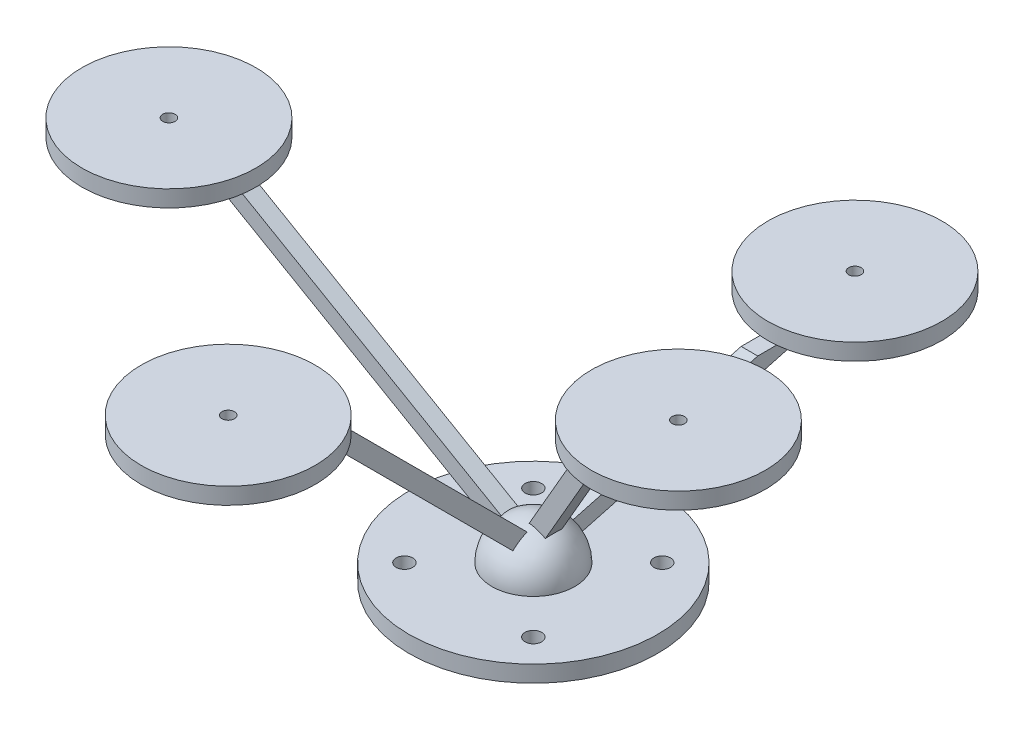
ISO-10303-21;
HEADER;
FILE_DESCRIPTION(('STEP AP214'),'2;1');
FILE_NAME('part.step','',(''),(''),'','','');
FILE_SCHEMA(('AUTOMOTIVE_DESIGN { 1 0 10303 214 1 1 1 1 }'));
ENDSEC;
DATA;
#1=APPLICATION_CONTEXT('core data for automotive mechanical design processes');
#2=APPLICATION_PROTOCOL_DEFINITION('international standard','automotive_design',2000,#1);
#3=PRODUCT_CONTEXT('',#1,'mechanical');
#4=PRODUCT('Part','Part','',(#3));
#5=PRODUCT_RELATED_PRODUCT_CATEGORY('part','',(#4));
#6=PRODUCT_DEFINITION_FORMATION('','',#4);
#7=PRODUCT_DEFINITION_CONTEXT('part definition',#1,'design');
#8=PRODUCT_DEFINITION('design','',#6,#7);
#9=PRODUCT_DEFINITION_SHAPE('','',#8);
#10=(LENGTH_UNIT() NAMED_UNIT(*) SI_UNIT(.MILLI.,.METRE.));
#11=(NAMED_UNIT(*) PLANE_ANGLE_UNIT() SI_UNIT($,.RADIAN.));
#12=(NAMED_UNIT(*) SI_UNIT($,.STERADIAN.) SOLID_ANGLE_UNIT());
#13=UNCERTAINTY_MEASURE_WITH_UNIT(LENGTH_MEASURE(1.E-05),#10,'distance_accuracy_value','');
#14=(GEOMETRIC_REPRESENTATION_CONTEXT(3) GLOBAL_UNCERTAINTY_ASSIGNED_CONTEXT((#13)) GLOBAL_UNIT_ASSIGNED_CONTEXT((#10,
#11,#12)) REPRESENTATION_CONTEXT('',''));
#15=CARTESIAN_POINT('',(0.,0.,0.));
#16=DIRECTION('',(0.,0.,1.));
#17=DIRECTION('',(1.,0.,0.));
#18=AXIS2_PLACEMENT_3D('',#15,#16,#17);
#19=CARTESIAN_POINT('',(0.,2.,0.));
#20=DIRECTION('',(0.,-1.,0.));
#21=DIRECTION('',(0.,0.,-1.));
#22=AXIS2_PLACEMENT_3D('',#19,#20,#21);
#23=SPHERICAL_SURFACE('',#22,5.);
#24=CARTESIAN_POINT('',(0.,2.,0.));
#25=DIRECTION('',(0.,1.,0.));
#26=DIRECTION('',(0.,0.,1.));
#27=AXIS2_PLACEMENT_3D('',#24,#25,#26);
#28=CIRCLE('',#27,5.);
#29=CARTESIAN_POINT('',(0.,2.,5.));
#30=VERTEX_POINT('',#29);
#31=EDGE_CURVE('E330',#30,#30,#28,.T.);
#32=ORIENTED_EDGE('',*,*,#31,.T.);
#33=EDGE_LOOP('',(#32));
#34=FACE_BOUND('',#33,.T.);
#35=CARTESIAN_POINT('',(1.,3.73205080756888,0.));
#36=DIRECTION('',(-0.500000000000001,-0.866025403784438,0.));
#37=DIRECTION('',(0.866025403784438,-0.500000000000001,0.));
#38=AXIS2_PLACEMENT_3D('',#35,#36,#37);
#39=CIRCLE('',#38,4.58257569495584);
#40=CARTESIAN_POINT('',(-2.87298334620741,5.96811878506867,-1.));
#41=VERTEX_POINT('',#40);
#42=CARTESIAN_POINT('',(-2.87298334620741,5.96811878506867,1.));
#43=VERTEX_POINT('',#42);
#44=EDGE_CURVE('E341',#41,#43,#39,.F.);
#45=ORIENTED_EDGE('',*,*,#44,.T.);
#46=CARTESIAN_POINT('',(0.,2.,1.));
#47=DIRECTION('',(0.,0.,-1.));
#48=DIRECTION('',(-1.,0.,0.));
#49=AXIS2_PLACEMENT_3D('',#46,#47,#48);
#50=CIRCLE('',#49,4.89897948556636);
#51=CARTESIAN_POINT('',(-4.24264068711928,4.44948974278318,1.));
#52=VERTEX_POINT('',#51);
#53=EDGE_CURVE('E348',#43,#52,#50,.F.);
#54=ORIENTED_EDGE('',*,*,#53,.T.);
#55=CARTESIAN_POINT('',(0.,2.,0.));
#56=DIRECTION('',(0.500000000000001,0.866025403784438,0.));
#57=DIRECTION('',(-0.866025403784438,0.500000000000001,0.));
#58=AXIS2_PLACEMENT_3D('',#55,#56,#57);
#59=CIRCLE('',#58,5.);
#60=CARTESIAN_POINT('',(-4.24264068711928,4.44948974278318,-1.));
#61=VERTEX_POINT('',#60);
#62=EDGE_CURVE('E345',#52,#61,#59,.F.);
#63=ORIENTED_EDGE('',*,*,#62,.T.);
#64=CARTESIAN_POINT('',(0.,2.,-1.));
#65=DIRECTION('',(0.,0.,-1.));
#66=DIRECTION('',(-1.,0.,0.));
#67=AXIS2_PLACEMENT_3D('',#64,#65,#66);
#68=CIRCLE('',#67,4.89897948556636);
#69=EDGE_CURVE('E337',#41,#61,#68,.F.);
#70=ORIENTED_EDGE('',*,*,#69,.F.);
#71=EDGE_LOOP('',(#45,#54,#63,#70));
#72=FACE_BOUND('',#71,.T.);
#73=CARTESIAN_POINT('',(0.,2.,0.));
#74=DIRECTION('',(-0.866025403784436,0.500000000000004,0.));
#75=DIRECTION('',(-0.500000000000004,-0.866025403784436,0.));
#76=AXIS2_PLACEMENT_3D('',#73,#74,#75);
#77=CIRCLE('',#76,5.);
#78=CARTESIAN_POINT('',(2.4494897427832,6.24264068711927,-1.));
#79=VERTEX_POINT('',#78);
#80=CARTESIAN_POINT('',(2.4494897427832,6.24264068711927,1.));
#81=VERTEX_POINT('',#80);
#82=EDGE_CURVE('E355',#79,#81,#77,.F.);
#83=ORIENTED_EDGE('',*,*,#82,.T.);
#84=CARTESIAN_POINT('',(0.504017169930937,6.87298334620741,1.));
#85=VERTEX_POINT('',#84);
#86=EDGE_CURVE('E351',#81,#85,#50,.F.);
#87=ORIENTED_EDGE('',*,*,#86,.T.);
#88=CARTESIAN_POINT('',(-1.73205080756887,3.00000000000001,0.));
#89=DIRECTION('',(0.866025403784436,-0.500000000000004,0.));
#90=DIRECTION('',(0.500000000000004,0.866025403784436,0.));
#91=AXIS2_PLACEMENT_3D('',#88,#89,#90);
#92=CIRCLE('',#91,4.58257569495584);
#93=CARTESIAN_POINT('',(0.504017169930937,6.87298334620741,-1.));
#94=VERTEX_POINT('',#93);
#95=EDGE_CURVE('E352',#85,#94,#92,.F.);
#96=ORIENTED_EDGE('',*,*,#95,.T.);
#97=EDGE_CURVE('E342',#79,#94,#68,.F.);
#98=ORIENTED_EDGE('',*,*,#97,.F.);
#99=EDGE_LOOP('',(#83,#87,#96,#98));
#100=FACE_BOUND('',#99,.T.);
#101=CARTESIAN_POINT('',(0.,3.41421356237309,-1.4142135623731));
#102=DIRECTION('',(0.,-0.707106781186546,0.707106781186549));
#103=DIRECTION('',(0.,-0.707106781186549,-0.707106781186546));
#104=AXIS2_PLACEMENT_3D('',#101,#102,#103);
#105=CIRCLE('',#104,4.58257569495584);
#106=CARTESIAN_POINT('',(-1.,6.57649122254148,1.74806409779528));
#107=VERTEX_POINT('',#106);
#108=CARTESIAN_POINT('',(1.,6.57649122254148,1.74806409779528));
#109=VERTEX_POINT('',#108);
#110=EDGE_CURVE('E183',#107,#109,#105,.F.);
#111=ORIENTED_EDGE('',*,*,#110,.T.);
#112=CARTESIAN_POINT('',(1.,2.,0.));
#113=DIRECTION('',(-1.,0.,0.));
#114=DIRECTION('',(0.,0.,1.));
#115=AXIS2_PLACEMENT_3D('',#112,#113,#114);
#116=CIRCLE('',#115,4.89897948556636);
#117=CARTESIAN_POINT('',(1.,5.46410161513776,3.46410161513775));
#118=VERTEX_POINT('',#117);
#119=EDGE_CURVE('E367',#109,#118,#116,.F.);
#120=ORIENTED_EDGE('',*,*,#119,.T.);
#121=CARTESIAN_POINT('',(0.,2.,0.));
#122=DIRECTION('',(0.,0.707106781186546,-0.707106781186549));
#123=DIRECTION('',(0.,0.707106781186549,0.707106781186546));
#124=AXIS2_PLACEMENT_3D('',#121,#122,#123);
#125=CIRCLE('',#124,5.);
#126=CARTESIAN_POINT('',(-1.,5.46410161513776,3.46410161513775));
#127=VERTEX_POINT('',#126);
#128=EDGE_CURVE('E364',#118,#127,#125,.F.);
#129=ORIENTED_EDGE('',*,*,#128,.T.);
#130=CARTESIAN_POINT('',(-1.,2.,0.));
#131=DIRECTION('',(-1.,0.,0.));
#132=DIRECTION('',(0.,0.,1.));
#133=AXIS2_PLACEMENT_3D('',#130,#131,#132);
#134=CIRCLE('',#133,4.89897948556636);
#135=EDGE_CURVE('E358',#107,#127,#134,.F.);
#136=ORIENTED_EDGE('',*,*,#135,.F.);
#137=EDGE_LOOP('',(#111,#120,#129,#136));
#138=FACE_BOUND('',#137,.T.);
#139=CARTESIAN_POINT('',(0.,2.,0.));
#140=DIRECTION('',(0.,0.96592582628907,0.258819045102514));
#141=DIRECTION('',(0.,-0.258819045102514,0.96592582628907));
#142=AXIS2_PLACEMENT_3D('',#139,#140,#141);
#143=CIRCLE('',#142,5.);
#144=CARTESIAN_POINT('',(-1.,3.26794919243109,-4.73205080756889));
#145=VERTEX_POINT('',#144);
#146=CARTESIAN_POINT('',(1.,3.26794919243109,-4.73205080756889));
#147=VERTEX_POINT('',#146);
#148=EDGE_CURVE('E45',#145,#147,#143,.F.);
#149=ORIENTED_EDGE('',*,*,#148,.T.);
#150=CARTESIAN_POINT('',(1.,5.08932561001975,-3.802113527405));
#151=VERTEX_POINT('',#150);
#152=EDGE_CURVE('E51',#147,#151,#116,.F.);
#153=ORIENTED_EDGE('',*,*,#152,.T.);
#154=CARTESIAN_POINT('',(0.,3.93185165257814,0.517638090205028));
#155=DIRECTION('',(0.,-0.96592582628907,-0.258819045102515));
#156=DIRECTION('',(0.,0.258819045102515,-0.96592582628907));
#157=AXIS2_PLACEMENT_3D('',#154,#155,#156);
#158=CIRCLE('',#157,4.58257569495584);
#159=CARTESIAN_POINT('',(-1.,5.08932561001975,-3.802113527405));
#160=VERTEX_POINT('',#159);
#161=EDGE_CURVE('E369',#151,#160,#158,.F.);
#162=ORIENTED_EDGE('',*,*,#161,.T.);
#163=EDGE_CURVE('E361',#145,#160,#134,.F.);
#164=ORIENTED_EDGE('',*,*,#163,.F.);
#165=EDGE_LOOP('',(#149,#153,#162,#164));
#166=FACE_BOUND('',#165,.T.);
#167=ADVANCED_FACE('F41',(#34,#72,#100,#138,#166),#23,.T.);
#168=CARTESIAN_POINT('',(0.,2.,0.));
#169=DIRECTION('',(0.,1.,0.));
#170=DIRECTION('',(0.,0.,1.));
#171=AXIS2_PLACEMENT_3D('',#168,#169,#170);
#172=PLANE('',#171);
#173=ORIENTED_EDGE('',*,*,#31,.F.);
#174=EDGE_LOOP('',(#173));
#175=FACE_BOUND('',#174,.T.);
#176=CARTESIAN_POINT('',(-7.77817459305207,2.,7.77817459305198));
#177=DIRECTION('',(0.,1.,0.));
#178=DIRECTION('',(0.,0.,1.));
#179=AXIS2_PLACEMENT_3D('',#176,#177,#178);
#180=CIRCLE('',#179,1.);
#181=CARTESIAN_POINT('',(-7.77817459305207,2.,8.77817459305198));
#182=VERTEX_POINT('',#181);
#183=EDGE_CURVE('E302',#182,#182,#180,.T.);
#184=ORIENTED_EDGE('',*,*,#183,.F.);
#185=EDGE_LOOP('',(#184));
#186=FACE_BOUND('',#185,.T.);
#187=CARTESIAN_POINT('',(7.77817459305206,2.,-7.77817459305199));
#188=DIRECTION('',(0.,1.,0.));
#189=DIRECTION('',(0.,0.,1.));
#190=AXIS2_PLACEMENT_3D('',#187,#188,#189);
#191=CIRCLE('',#190,1.);
#192=CARTESIAN_POINT('',(7.77817459305206,2.,-6.77817459305198));
#193=VERTEX_POINT('',#192);
#194=EDGE_CURVE('E318',#193,#193,#191,.T.);
#195=ORIENTED_EDGE('',*,*,#194,.F.);
#196=EDGE_LOOP('',(#195));
#197=FACE_BOUND('',#196,.T.);
#198=CARTESIAN_POINT('',(0.,2.,0.));
#199=DIRECTION('',(0.,1.,0.));
#200=DIRECTION('',(0.,0.,1.));
#201=AXIS2_PLACEMENT_3D('',#198,#199,#200);
#202=CIRCLE('',#201,15.);
#203=CARTESIAN_POINT('',(0.,2.,15.));
#204=VERTEX_POINT('',#203);
#205=EDGE_CURVE('E326',#204,#204,#202,.T.);
#206=ORIENTED_EDGE('',*,*,#205,.T.);
#207=EDGE_LOOP('',(#206));
#208=FACE_BOUND('',#207,.T.);
#209=CARTESIAN_POINT('',(-7.77817459305204,2.,-7.77817459305201));
#210=DIRECTION('',(0.,1.,0.));
#211=DIRECTION('',(0.,0.,1.));
#212=AXIS2_PLACEMENT_3D('',#209,#210,#211);
#213=CIRCLE('',#212,0.999999999999995);
#214=CARTESIAN_POINT('',(-7.77817459305204,2.,-6.77817459305201));
#215=VERTEX_POINT('',#214);
#216=EDGE_CURVE('E310',#215,#215,#213,.T.);
#217=ORIENTED_EDGE('',*,*,#216,.F.);
#218=EDGE_LOOP('',(#217));
#219=FACE_BOUND('',#218,.T.);
#220=CARTESIAN_POINT('',(7.77817459305204,2.,7.77817459305201));
#221=DIRECTION('',(0.,1.,0.));
#222=DIRECTION('',(0.,0.,1.));
#223=AXIS2_PLACEMENT_3D('',#220,#221,#222);
#224=CIRCLE('',#223,1.);
#225=CARTESIAN_POINT('',(7.77817459305204,2.,8.77817459305201));
#226=VERTEX_POINT('',#225);
#227=EDGE_CURVE('E294',#226,#226,#224,.T.);
#228=ORIENTED_EDGE('',*,*,#227,.F.);
#229=EDGE_LOOP('',(#228));
#230=FACE_BOUND('',#229,.T.);
#231=ADVANCED_FACE('F467',(#175,#186,#197,#208,#219,#230),#172,.T.);
#232=CARTESIAN_POINT('',(0.,0.,0.));
#233=DIRECTION('',(0.,1.,0.));
#234=DIRECTION('',(0.,0.,1.));
#235=AXIS2_PLACEMENT_3D('',#232,#233,#234);
#236=PLANE('',#235);
#237=CARTESIAN_POINT('',(0.,0.,0.));
#238=DIRECTION('',(0.,1.,0.));
#239=DIRECTION('',(0.,0.,1.));
#240=AXIS2_PLACEMENT_3D('',#237,#238,#239);
#241=CIRCLE('',#240,15.);
#242=CARTESIAN_POINT('',(0.,0.,15.));
#243=VERTEX_POINT('',#242);
#244=EDGE_CURVE('E322',#243,#243,#241,.T.);
#245=ORIENTED_EDGE('',*,*,#244,.F.);
#246=EDGE_LOOP('',(#245));
#247=FACE_BOUND('',#246,.T.);
#248=CARTESIAN_POINT('',(7.77817459305206,0.,-7.77817459305199));
#249=DIRECTION('',(0.,1.,0.));
#250=DIRECTION('',(0.,0.,1.));
#251=AXIS2_PLACEMENT_3D('',#248,#249,#250);
#252=CIRCLE('',#251,1.);
#253=CARTESIAN_POINT('',(7.77817459305206,0.,-6.77817459305198));
#254=VERTEX_POINT('',#253);
#255=EDGE_CURVE('E314',#254,#254,#252,.T.);
#256=ORIENTED_EDGE('',*,*,#255,.T.);
#257=EDGE_LOOP('',(#256));
#258=FACE_BOUND('',#257,.T.);
#259=CARTESIAN_POINT('',(-7.77817459305204,0.,-7.77817459305201));
#260=DIRECTION('',(0.,1.,0.));
#261=DIRECTION('',(0.,0.,1.));
#262=AXIS2_PLACEMENT_3D('',#259,#260,#261);
#263=CIRCLE('',#262,0.999999999999995);
#264=CARTESIAN_POINT('',(-7.77817459305204,0.,-6.77817459305201));
#265=VERTEX_POINT('',#264);
#266=EDGE_CURVE('E306',#265,#265,#263,.T.);
#267=ORIENTED_EDGE('',*,*,#266,.T.);
#268=EDGE_LOOP('',(#267));
#269=FACE_BOUND('',#268,.T.);
#270=CARTESIAN_POINT('',(-7.77817459305207,0.,7.77817459305198));
#271=DIRECTION('',(0.,1.,0.));
#272=DIRECTION('',(0.,0.,1.));
#273=AXIS2_PLACEMENT_3D('',#270,#271,#272);
#274=CIRCLE('',#273,1.);
#275=CARTESIAN_POINT('',(-7.77817459305207,0.,8.77817459305198));
#276=VERTEX_POINT('',#275);
#277=EDGE_CURVE('E298',#276,#276,#274,.T.);
#278=ORIENTED_EDGE('',*,*,#277,.T.);
#279=EDGE_LOOP('',(#278));
#280=FACE_BOUND('',#279,.T.);
#281=CARTESIAN_POINT('',(7.77817459305204,0.,7.77817459305201));
#282=DIRECTION('',(0.,1.,0.));
#283=DIRECTION('',(0.,0.,1.));
#284=AXIS2_PLACEMENT_3D('',#281,#282,#283);
#285=CIRCLE('',#284,1.);
#286=CARTESIAN_POINT('',(7.77817459305204,0.,8.77817459305201));
#287=VERTEX_POINT('',#286);
#288=EDGE_CURVE('E293',#287,#287,#285,.T.);
#289=ORIENTED_EDGE('',*,*,#288,.T.);
#290=EDGE_LOOP('',(#289));
#291=FACE_BOUND('',#290,.T.);
#292=ADVANCED_FACE('F475',(#247,#258,#269,#280,#291),#236,.F.);
#293=CARTESIAN_POINT('',(0.,2.,0.));
#294=DIRECTION('',(0.,-1.,0.));
#295=DIRECTION('',(0.,0.,-1.));
#296=AXIS2_PLACEMENT_3D('',#293,#294,#295);
#297=CYLINDRICAL_SURFACE('',#296,15.);
#298=ORIENTED_EDGE('',*,*,#205,.F.);
#299=EDGE_LOOP('',(#298));
#300=FACE_BOUND('',#299,.T.);
#301=ORIENTED_EDGE('',*,*,#244,.T.);
#302=EDGE_LOOP('',(#301));
#303=FACE_BOUND('',#302,.T.);
#304=ADVANCED_FACE('F43',(#300,#303),#297,.T.);
#305=CARTESIAN_POINT('',(7.77817459305206,2.,-7.77817459305199));
#306=DIRECTION('',(0.,-1.,0.));
#307=DIRECTION('',(0.,0.,-1.));
#308=AXIS2_PLACEMENT_3D('',#305,#306,#307);
#309=CYLINDRICAL_SURFACE('',#308,1.);
#310=ORIENTED_EDGE('',*,*,#194,.T.);
#311=EDGE_LOOP('',(#310));
#312=FACE_BOUND('',#311,.T.);
#313=ORIENTED_EDGE('',*,*,#255,.F.);
#314=EDGE_LOOP('',(#313));
#315=FACE_BOUND('',#314,.T.);
#316=ADVANCED_FACE('F495',(#312,#315),#309,.F.);
#317=CARTESIAN_POINT('',(-7.77817459305204,2.,-7.77817459305201));
#318=DIRECTION('',(0.,-1.,0.));
#319=DIRECTION('',(0.,0.,-1.));
#320=AXIS2_PLACEMENT_3D('',#317,#318,#319);
#321=CYLINDRICAL_SURFACE('',#320,0.999999999999995);
#322=ORIENTED_EDGE('',*,*,#216,.T.);
#323=EDGE_LOOP('',(#322));
#324=FACE_BOUND('',#323,.T.);
#325=ORIENTED_EDGE('',*,*,#266,.F.);
#326=EDGE_LOOP('',(#325));
#327=FACE_BOUND('',#326,.T.);
#328=ADVANCED_FACE('F491',(#324,#327),#321,.F.);
#329=CARTESIAN_POINT('',(-7.77817459305207,2.,7.77817459305198));
#330=DIRECTION('',(0.,-1.,0.));
#331=DIRECTION('',(0.,0.,-1.));
#332=AXIS2_PLACEMENT_3D('',#329,#330,#331);
#333=CYLINDRICAL_SURFACE('',#332,1.);
#334=ORIENTED_EDGE('',*,*,#183,.T.);
#335=EDGE_LOOP('',(#334));
#336=FACE_BOUND('',#335,.T.);
#337=ORIENTED_EDGE('',*,*,#277,.F.);
#338=EDGE_LOOP('',(#337));
#339=FACE_BOUND('',#338,.T.);
#340=ADVANCED_FACE('F487',(#336,#339),#333,.F.);
#341=CARTESIAN_POINT('',(7.77817459305204,2.,7.77817459305201));
#342=DIRECTION('',(0.,-1.,0.));
#343=DIRECTION('',(0.,0.,-1.));
#344=AXIS2_PLACEMENT_3D('',#341,#342,#343);
#345=CYLINDRICAL_SURFACE('',#344,1.);
#346=ORIENTED_EDGE('',*,*,#227,.T.);
#347=EDGE_LOOP('',(#346));
#348=FACE_BOUND('',#347,.T.);
#349=ORIENTED_EDGE('',*,*,#288,.F.);
#350=EDGE_LOOP('',(#349));
#351=FACE_BOUND('',#350,.T.);
#352=ADVANCED_FACE('F483',(#348,#351),#345,.F.);
#353=CARTESIAN_POINT('',(0.,0.,1.));
#354=DIRECTION('',(0.,0.,-1.));
#355=DIRECTION('',(-1.,0.,0.));
#356=AXIS2_PLACEMENT_3D('',#353,#354,#355);
#357=PLANE('',#356);
#358=ORIENTED_EDGE('',*,*,#53,.F.);
#359=DIRECTION('',(-0.866025403784438,0.500000000000001,0.));
#360=VECTOR('',#359,1.);
#361=CARTESIAN_POINT('',(-34.9711431702997,24.5,1.));
#362=LINE('',#361,#360);
#363=CARTESIAN_POINT('',(-34.9711431702997,24.5,1.));
#364=VERTEX_POINT('',#363);
#365=EDGE_CURVE('E251',#43,#364,#362,.T.);
#366=ORIENTED_EDGE('',*,*,#365,.T.);
#367=DIRECTION('',(-1.,0.,0.));
#368=VECTOR('',#367,1.);
#369=CARTESIAN_POINT('',(-38.9711431702997,24.5,1.));
#370=LINE('',#369,#368);
#371=CARTESIAN_POINT('',(-38.9711431702997,24.5,1.));
#372=VERTEX_POINT('',#371);
#373=EDGE_CURVE('E254',#364,#372,#370,.T.);
#374=ORIENTED_EDGE('',*,*,#373,.T.);
#375=DIRECTION('',(0.866025403784438,-0.500000000000001,0.));
#376=VECTOR('',#375,1.);
#377=CARTESIAN_POINT('',(0.,2.,1.));
#378=LINE('',#377,#376);
#379=EDGE_CURVE('E236',#372,#52,#378,.T.);
#380=ORIENTED_EDGE('',*,*,#379,.T.);
#381=EDGE_LOOP('',(#358,#366,#374,#380));
#382=FACE_BOUND('',#381,.T.);
#383=ADVANCED_FACE('F486',(#382),#357,.F.);
#384=CARTESIAN_POINT('',(0.,0.,-1.));
#385=DIRECTION('',(0.,0.,-1.));
#386=DIRECTION('',(-1.,0.,0.));
#387=AXIS2_PLACEMENT_3D('',#384,#385,#386);
#388=PLANE('',#387);
#389=DIRECTION('',(-0.866025403784438,0.500000000000001,0.));
#390=VECTOR('',#389,1.);
#391=CARTESIAN_POINT('',(-34.9711431702997,24.5,-1.));
#392=LINE('',#391,#390);
#393=CARTESIAN_POINT('',(-34.9711431702997,24.5,-1.));
#394=VERTEX_POINT('',#393);
#395=EDGE_CURVE('E273',#41,#394,#392,.T.);
#396=ORIENTED_EDGE('',*,*,#395,.F.);
#397=ORIENTED_EDGE('',*,*,#69,.T.);
#398=DIRECTION('',(0.866025403784438,-0.500000000000001,0.));
#399=VECTOR('',#398,1.);
#400=CARTESIAN_POINT('',(0.,2.,-1.));
#401=LINE('',#400,#399);
#402=CARTESIAN_POINT('',(-38.9711431702997,24.5,-1.));
#403=VERTEX_POINT('',#402);
#404=EDGE_CURVE('E232',#403,#61,#401,.T.);
#405=ORIENTED_EDGE('',*,*,#404,.F.);
#406=DIRECTION('',(-1.,0.,0.));
#407=VECTOR('',#406,1.);
#408=CARTESIAN_POINT('',(-38.9711431702997,24.5,-1.));
#409=LINE('',#408,#407);
#410=EDGE_CURVE('E241',#394,#403,#409,.T.);
#411=ORIENTED_EDGE('',*,*,#410,.F.);
#412=EDGE_LOOP('',(#396,#397,#405,#411));
#413=FACE_BOUND('',#412,.T.);
#414=ADVANCED_FACE('F556',(#413),#388,.T.);
#415=CARTESIAN_POINT('',(-34.9711431702997,24.5,1.));
#416=DIRECTION('',(-0.500000000000001,-0.866025403784438,0.));
#417=DIRECTION('',(0.866025403784438,-0.500000000000001,0.));
#418=AXIS2_PLACEMENT_3D('',#415,#416,#417);
#419=PLANE('',#418);
#420=ORIENTED_EDGE('',*,*,#44,.F.);
#421=ORIENTED_EDGE('',*,*,#395,.T.);
#422=DIRECTION('',(0.,0.,-1.));
#423=VECTOR('',#422,1.);
#424=CARTESIAN_POINT('',(-34.9711431702997,24.5,1.));
#425=LINE('',#424,#423);
#426=EDGE_CURVE('E282',#364,#394,#425,.T.);
#427=ORIENTED_EDGE('',*,*,#426,.F.);
#428=ORIENTED_EDGE('',*,*,#365,.F.);
#429=EDGE_LOOP('',(#420,#421,#427,#428));
#430=FACE_BOUND('',#429,.T.);
#431=ADVANCED_FACE('F566',(#430),#419,.F.);
#432=CARTESIAN_POINT('',(0.,2.,1.));
#433=DIRECTION('',(0.500000000000001,0.866025403784438,0.));
#434=DIRECTION('',(-0.866025403784438,0.500000000000001,0.));
#435=AXIS2_PLACEMENT_3D('',#432,#433,#434);
#436=PLANE('',#435);
#437=ORIENTED_EDGE('',*,*,#62,.F.);
#438=ORIENTED_EDGE('',*,*,#379,.F.);
#439=DIRECTION('',(0.,0.,-1.));
#440=VECTOR('',#439,1.);
#441=CARTESIAN_POINT('',(-38.9711431702997,24.5,1.));
#442=LINE('',#441,#440);
#443=EDGE_CURVE('E257',#372,#403,#442,.T.);
#444=ORIENTED_EDGE('',*,*,#443,.T.);
#445=ORIENTED_EDGE('',*,*,#404,.T.);
#446=EDGE_LOOP('',(#437,#438,#444,#445));
#447=FACE_BOUND('',#446,.T.);
#448=ADVANCED_FACE('F481',(#447),#436,.F.);
#449=ORIENTED_EDGE('',*,*,#86,.F.);
#450=DIRECTION('',(0.500000000000004,0.866025403784436,0.));
#451=VECTOR('',#450,1.);
#452=CARTESIAN_POINT('',(0.,2.,1.));
#453=LINE('',#452,#451);
#454=CARTESIAN_POINT('',(12.5000000000001,23.6506350946109,1.));
#455=VERTEX_POINT('',#454);
#456=EDGE_CURVE('E240',#81,#455,#453,.T.);
#457=ORIENTED_EDGE('',*,*,#456,.T.);
#458=DIRECTION('',(-1.,0.,0.));
#459=VECTOR('',#458,1.);
#460=CARTESIAN_POINT('',(10.1905989232416,23.6506350946109,1.));
#461=LINE('',#460,#459);
#462=CARTESIAN_POINT('',(10.1905989232416,23.6506350946109,1.));
#463=VERTEX_POINT('',#462);
#464=EDGE_CURVE('E244',#455,#463,#461,.T.);
#465=ORIENTED_EDGE('',*,*,#464,.T.);
#466=DIRECTION('',(-0.500000000000004,-0.866025403784436,0.));
#467=VECTOR('',#466,1.);
#468=CARTESIAN_POINT('',(0.,5.99999999999997,1.));
#469=LINE('',#468,#467);
#470=EDGE_CURVE('E247',#463,#85,#469,.T.);
#471=ORIENTED_EDGE('',*,*,#470,.T.);
#472=EDGE_LOOP('',(#449,#457,#465,#471));
#473=FACE_BOUND('',#472,.T.);
#474=ADVANCED_FACE('F559',(#473),#357,.F.);
#475=DIRECTION('',(0.500000000000004,0.866025403784436,0.));
#476=VECTOR('',#475,1.);
#477=CARTESIAN_POINT('',(0.,2.,-1.));
#478=LINE('',#477,#476);
#479=CARTESIAN_POINT('',(12.5000000000001,23.6506350946109,-1.));
#480=VERTEX_POINT('',#479);
#481=EDGE_CURVE('E261',#79,#480,#478,.T.);
#482=ORIENTED_EDGE('',*,*,#481,.F.);
#483=ORIENTED_EDGE('',*,*,#97,.T.);
#484=DIRECTION('',(-0.500000000000004,-0.866025403784436,0.));
#485=VECTOR('',#484,1.);
#486=CARTESIAN_POINT('',(0.,5.99999999999997,-1.));
#487=LINE('',#486,#485);
#488=CARTESIAN_POINT('',(10.1905989232416,23.6506350946109,-1.));
#489=VERTEX_POINT('',#488);
#490=EDGE_CURVE('E269',#489,#94,#487,.T.);
#491=ORIENTED_EDGE('',*,*,#490,.F.);
#492=DIRECTION('',(-1.,0.,0.));
#493=VECTOR('',#492,1.);
#494=CARTESIAN_POINT('',(10.1905989232416,23.6506350946109,-1.));
#495=LINE('',#494,#493);
#496=EDGE_CURVE('E265',#480,#489,#495,.T.);
#497=ORIENTED_EDGE('',*,*,#496,.F.);
#498=EDGE_LOOP('',(#482,#483,#491,#497));
#499=FACE_BOUND('',#498,.T.);
#500=ADVANCED_FACE('F569',(#499),#388,.T.);
#501=CARTESIAN_POINT('',(0.,2.,1.));
#502=DIRECTION('',(-0.866025403784436,0.500000000000004,0.));
#503=DIRECTION('',(-0.500000000000004,-0.866025403784436,0.));
#504=AXIS2_PLACEMENT_3D('',#501,#502,#503);
#505=PLANE('',#504);
#506=ORIENTED_EDGE('',*,*,#82,.F.);
#507=ORIENTED_EDGE('',*,*,#481,.T.);
#508=DIRECTION('',(0.,0.,-1.));
#509=VECTOR('',#508,1.);
#510=CARTESIAN_POINT('',(12.5000000000001,23.6506350946109,1.));
#511=LINE('',#510,#509);
#512=EDGE_CURVE('E289',#455,#480,#511,.T.);
#513=ORIENTED_EDGE('',*,*,#512,.F.);
#514=ORIENTED_EDGE('',*,*,#456,.F.);
#515=EDGE_LOOP('',(#506,#507,#513,#514));
#516=FACE_BOUND('',#515,.T.);
#517=ADVANCED_FACE('F595',(#516),#505,.F.);
#518=CARTESIAN_POINT('',(0.,5.99999999999997,1.));
#519=DIRECTION('',(0.866025403784436,-0.500000000000004,0.));
#520=DIRECTION('',(0.500000000000004,0.866025403784436,0.));
#521=AXIS2_PLACEMENT_3D('',#518,#519,#520);
#522=PLANE('',#521);
#523=ORIENTED_EDGE('',*,*,#95,.F.);
#524=ORIENTED_EDGE('',*,*,#470,.F.);
#525=DIRECTION('',(0.,0.,-1.));
#526=VECTOR('',#525,1.);
#527=CARTESIAN_POINT('',(10.1905989232416,23.6506350946109,1.));
#528=LINE('',#527,#526);
#529=EDGE_CURVE('E286',#463,#489,#528,.T.);
#530=ORIENTED_EDGE('',*,*,#529,.T.);
#531=ORIENTED_EDGE('',*,*,#490,.T.);
#532=EDGE_LOOP('',(#523,#524,#530,#531));
#533=FACE_BOUND('',#532,.T.);
#534=ADVANCED_FACE('F602',(#533),#522,.F.);
#535=CARTESIAN_POINT('',(17.5000000000001,23.6506350946109,0.));
#536=DIRECTION('',(0.,1.,0.));
#537=DIRECTION('',(0.,0.,1.));
#538=AXIS2_PLACEMENT_3D('',#535,#536,#537);
#539=PLANE('',#538);
#540=CARTESIAN_POINT('',(17.5000000000001,23.6506350946109,0.));
#541=DIRECTION('',(0.,1.,0.));
#542=DIRECTION('',(0.,0.,1.));
#543=AXIS2_PLACEMENT_3D('',#540,#541,#542);
#544=CIRCLE('',#543,10.5);
#545=CARTESIAN_POINT('',(17.5000000000001,23.6506350946109,10.5));
#546=VERTEX_POINT('',#545);
#547=EDGE_CURVE('E224',#546,#546,#544,.T.);
#548=ORIENTED_EDGE('',*,*,#547,.F.);
#549=EDGE_LOOP('',(#548));
#550=FACE_BOUND('',#549,.T.);
#551=CARTESIAN_POINT('',(17.5000000000001,23.6506350946109,0.));
#552=DIRECTION('',(0.,1.,0.));
#553=DIRECTION('',(0.,0.,1.));
#554=AXIS2_PLACEMENT_3D('',#551,#552,#553);
#555=CIRCLE('',#554,0.750000000000002);
#556=CARTESIAN_POINT('',(17.5000000000001,23.6506350946109,0.750000000000002));
#557=VERTEX_POINT('',#556);
#558=EDGE_CURVE('E216',#557,#557,#555,.T.);
#559=ORIENTED_EDGE('',*,*,#558,.T.);
#560=EDGE_LOOP('',(#559));
#561=FACE_BOUND('',#560,.T.);
#562=ORIENTED_EDGE('',*,*,#512,.T.);
#563=ORIENTED_EDGE('',*,*,#496,.T.);
#564=ORIENTED_EDGE('',*,*,#529,.F.);
#565=ORIENTED_EDGE('',*,*,#464,.F.);
#566=EDGE_LOOP('',(#562,#563,#564,#565));
#567=FACE_BOUND('',#566,.T.);
#568=ADVANCED_FACE('F609',(#550,#561,#567),#539,.F.);
#569=CARTESIAN_POINT('',(17.5000000000001,25.6506350946109,0.));
#570=DIRECTION('',(0.,1.,0.));
#571=DIRECTION('',(0.,0.,1.));
#572=AXIS2_PLACEMENT_3D('',#569,#570,#571);
#573=PLANE('',#572);
#574=CARTESIAN_POINT('',(17.5000000000001,25.6506350946109,0.));
#575=DIRECTION('',(0.,1.,0.));
#576=DIRECTION('',(0.,0.,1.));
#577=AXIS2_PLACEMENT_3D('',#574,#575,#576);
#578=CIRCLE('',#577,10.5);
#579=CARTESIAN_POINT('',(17.5000000000001,25.6506350946109,10.5));
#580=VERTEX_POINT('',#579);
#581=EDGE_CURVE('E228',#580,#580,#578,.T.);
#582=ORIENTED_EDGE('',*,*,#581,.T.);
#583=EDGE_LOOP('',(#582));
#584=FACE_BOUND('',#583,.T.);
#585=CARTESIAN_POINT('',(17.5000000000001,25.6506350946109,0.));
#586=DIRECTION('',(0.,1.,0.));
#587=DIRECTION('',(0.,0.,1.));
#588=AXIS2_PLACEMENT_3D('',#585,#586,#587);
#589=CIRCLE('',#588,0.750000000000002);
#590=CARTESIAN_POINT('',(17.5000000000001,25.6506350946109,0.750000000000002));
#591=VERTEX_POINT('',#590);
#592=EDGE_CURVE('E220',#591,#591,#589,.T.);
#593=ORIENTED_EDGE('',*,*,#592,.F.);
#594=EDGE_LOOP('',(#593));
#595=FACE_BOUND('',#594,.T.);
#596=ADVANCED_FACE('F617',(#584,#595),#573,.T.);
#597=CARTESIAN_POINT('',(17.5000000000001,25.6506350946109,0.));
#598=DIRECTION('',(0.,-1.,0.));
#599=DIRECTION('',(0.,0.,-1.));
#600=AXIS2_PLACEMENT_3D('',#597,#598,#599);
#601=CYLINDRICAL_SURFACE('',#600,10.5);
#602=ORIENTED_EDGE('',*,*,#581,.F.);
#603=EDGE_LOOP('',(#602));
#604=FACE_BOUND('',#603,.T.);
#605=ORIENTED_EDGE('',*,*,#547,.T.);
#606=EDGE_LOOP('',(#605));
#607=FACE_BOUND('',#606,.T.);
#608=ADVANCED_FACE('F625',(#604,#607),#601,.T.);
#609=CARTESIAN_POINT('',(17.5000000000001,25.6506350946109,0.));
#610=DIRECTION('',(0.,-1.,0.));
#611=DIRECTION('',(0.,0.,-1.));
#612=AXIS2_PLACEMENT_3D('',#609,#610,#611);
#613=CYLINDRICAL_SURFACE('',#612,0.750000000000002);
#614=ORIENTED_EDGE('',*,*,#592,.T.);
#615=EDGE_LOOP('',(#614));
#616=FACE_BOUND('',#615,.T.);
#617=ORIENTED_EDGE('',*,*,#558,.F.);
#618=EDGE_LOOP('',(#617));
#619=FACE_BOUND('',#618,.T.);
#620=ADVANCED_FACE('F633',(#616,#619),#613,.F.);
#621=CARTESIAN_POINT('',(-43.9711431702997,24.5000000000001,0.));
#622=DIRECTION('',(0.,1.,0.));
#623=DIRECTION('',(0.,0.,1.));
#624=AXIS2_PLACEMENT_3D('',#621,#622,#623);
#625=PLANE('',#624);
#626=CARTESIAN_POINT('',(-43.9711431702997,24.5000000000001,0.));
#627=DIRECTION('',(0.,1.,0.));
#628=DIRECTION('',(0.,0.,1.));
#629=AXIS2_PLACEMENT_3D('',#626,#627,#628);
#630=CIRCLE('',#629,10.5);
#631=CARTESIAN_POINT('',(-43.9711431702997,24.5000000000001,10.5));
#632=VERTEX_POINT('',#631);
#633=EDGE_CURVE('E208',#632,#632,#630,.T.);
#634=ORIENTED_EDGE('',*,*,#633,.F.);
#635=EDGE_LOOP('',(#634));
#636=FACE_BOUND('',#635,.T.);
#637=CARTESIAN_POINT('',(-43.9711431702997,24.5000000000001,0.));
#638=DIRECTION('',(0.,1.,0.));
#639=DIRECTION('',(0.,0.,1.));
#640=AXIS2_PLACEMENT_3D('',#637,#638,#639);
#641=CIRCLE('',#640,0.749999999999999);
#642=CARTESIAN_POINT('',(-43.9711431702997,24.5000000000001,0.749999999999999));
#643=VERTEX_POINT('',#642);
#644=EDGE_CURVE('E203',#643,#643,#641,.T.);
#645=ORIENTED_EDGE('',*,*,#644,.T.);
#646=EDGE_LOOP('',(#645));
#647=FACE_BOUND('',#646,.T.);
#648=ORIENTED_EDGE('',*,*,#426,.T.);
#649=ORIENTED_EDGE('',*,*,#410,.T.);
#650=ORIENTED_EDGE('',*,*,#443,.F.);
#651=ORIENTED_EDGE('',*,*,#373,.F.);
#652=EDGE_LOOP('',(#648,#649,#650,#651));
#653=FACE_BOUND('',#652,.T.);
#654=ADVANCED_FACE('F640',(#636,#647,#653),#625,.F.);
#655=CARTESIAN_POINT('',(-43.9711431702997,26.5000000000001,0.));
#656=DIRECTION('',(0.,1.,0.));
#657=DIRECTION('',(0.,0.,1.));
#658=AXIS2_PLACEMENT_3D('',#655,#656,#657);
#659=PLANE('',#658);
#660=CARTESIAN_POINT('',(-43.9711431702997,26.5000000000001,0.));
#661=DIRECTION('',(0.,1.,0.));
#662=DIRECTION('',(0.,0.,1.));
#663=AXIS2_PLACEMENT_3D('',#660,#661,#662);
#664=CIRCLE('',#663,10.5);
#665=CARTESIAN_POINT('',(-43.9711431702997,26.5000000000001,10.5));
#666=VERTEX_POINT('',#665);
#667=EDGE_CURVE('E212',#666,#666,#664,.T.);
#668=ORIENTED_EDGE('',*,*,#667,.T.);
#669=EDGE_LOOP('',(#668));
#670=FACE_BOUND('',#669,.T.);
#671=CARTESIAN_POINT('',(-43.9711431702997,26.5000000000001,0.));
#672=DIRECTION('',(0.,1.,0.));
#673=DIRECTION('',(0.,0.,1.));
#674=AXIS2_PLACEMENT_3D('',#671,#672,#673);
#675=CIRCLE('',#674,0.749999999999999);
#676=CARTESIAN_POINT('',(-43.9711431702997,26.5000000000001,0.749999999999999));
#677=VERTEX_POINT('',#676);
#678=EDGE_CURVE('E204',#677,#677,#675,.T.);
#679=ORIENTED_EDGE('',*,*,#678,.F.);
#680=EDGE_LOOP('',(#679));
#681=FACE_BOUND('',#680,.T.);
#682=ADVANCED_FACE('F647',(#670,#681),#659,.T.);
#683=CARTESIAN_POINT('',(-43.9711431702997,26.5000000000001,0.));
#684=DIRECTION('',(0.,-1.,0.));
#685=DIRECTION('',(0.,0.,-1.));
#686=AXIS2_PLACEMENT_3D('',#683,#684,#685);
#687=CYLINDRICAL_SURFACE('',#686,10.5);
#688=ORIENTED_EDGE('',*,*,#667,.F.);
#689=EDGE_LOOP('',(#688));
#690=FACE_BOUND('',#689,.T.);
#691=ORIENTED_EDGE('',*,*,#633,.T.);
#692=EDGE_LOOP('',(#691));
#693=FACE_BOUND('',#692,.T.);
#694=ADVANCED_FACE('F655',(#690,#693),#687,.T.);
#695=CARTESIAN_POINT('',(-43.9711431702997,26.5000000000001,0.));
#696=DIRECTION('',(0.,-1.,0.));
#697=DIRECTION('',(0.,0.,-1.));
#698=AXIS2_PLACEMENT_3D('',#695,#696,#697);
#699=CYLINDRICAL_SURFACE('',#698,0.749999999999999);
#700=ORIENTED_EDGE('',*,*,#678,.T.);
#701=EDGE_LOOP('',(#700));
#702=FACE_BOUND('',#701,.T.);
#703=ORIENTED_EDGE('',*,*,#644,.F.);
#704=EDGE_LOOP('',(#703));
#705=FACE_BOUND('',#704,.T.);
#706=ADVANCED_FACE('F663',(#702,#705),#699,.F.);
#707=CARTESIAN_POINT('',(1.,0.,0.));
#708=DIRECTION('',(-1.,0.,0.));
#709=DIRECTION('',(0.,0.,1.));
#710=AXIS2_PLACEMENT_3D('',#707,#708,#709);
#711=PLANE('',#710);
#712=ORIENTED_EDGE('',*,*,#119,.F.);
#713=DIRECTION('',(0.,0.707106781186549,0.707106781186546));
#714=VECTOR('',#713,1.);
#715=CARTESIAN_POINT('',(1.,4.82842712474619,0.));
#716=LINE('',#715,#714);
#717=CARTESIAN_POINT('',(1.,33.8198051533947,28.9913780286484));
#718=VERTEX_POINT('',#717);
#719=EDGE_CURVE('E402',#109,#718,#716,.T.);
#720=ORIENTED_EDGE('',*,*,#719,.T.);
#721=DIRECTION('',(0.,0.,1.));
#722=VECTOR('',#721,1.);
#723=CARTESIAN_POINT('',(1.,33.8198051533947,31.8198051533946));
#724=LINE('',#723,#722);
#725=CARTESIAN_POINT('',(1.,33.8198051533947,31.8198051533946));
#726=VERTEX_POINT('',#725);
#727=EDGE_CURVE('E188',#718,#726,#724,.T.);
#728=ORIENTED_EDGE('',*,*,#727,.T.);
#729=DIRECTION('',(0.,-0.707106781186548,-0.707106781186546));
#730=VECTOR('',#729,1.);
#731=CARTESIAN_POINT('',(1.,2.,0.));
#732=LINE('',#731,#730);
#733=EDGE_CURVE('E174',#726,#118,#732,.T.);
#734=ORIENTED_EDGE('',*,*,#733,.T.);
#735=EDGE_LOOP('',(#712,#720,#728,#734));
#736=FACE_BOUND('',#735,.T.);
#737=ADVANCED_FACE('F670',(#736),#711,.F.);
#738=CARTESIAN_POINT('',(-1.,0.,0.));
#739=DIRECTION('',(-1.,0.,0.));
#740=DIRECTION('',(0.,0.,1.));
#741=AXIS2_PLACEMENT_3D('',#738,#739,#740);
#742=PLANE('',#741);
#743=DIRECTION('',(0.,0.707106781186549,0.707106781186546));
#744=VECTOR('',#743,1.);
#745=CARTESIAN_POINT('',(-1.,4.82842712474619,0.));
#746=LINE('',#745,#744);
#747=CARTESIAN_POINT('',(-1.,33.8198051533947,28.9913780286484));
#748=VERTEX_POINT('',#747);
#749=EDGE_CURVE('E167',#107,#748,#746,.T.);
#750=ORIENTED_EDGE('',*,*,#749,.F.);
#751=ORIENTED_EDGE('',*,*,#135,.T.);
#752=DIRECTION('',(0.,-0.707106781186548,-0.707106781186546));
#753=VECTOR('',#752,1.);
#754=CARTESIAN_POINT('',(-1.,2.,0.));
#755=LINE('',#754,#753);
#756=CARTESIAN_POINT('',(-1.,33.8198051533947,31.8198051533946));
#757=VERTEX_POINT('',#756);
#758=EDGE_CURVE('E169',#757,#127,#755,.T.);
#759=ORIENTED_EDGE('',*,*,#758,.F.);
#760=DIRECTION('',(0.,0.,1.));
#761=VECTOR('',#760,1.);
#762=CARTESIAN_POINT('',(-1.,33.8198051533947,31.8198051533946));
#763=LINE('',#762,#761);
#764=EDGE_CURVE('E163',#748,#757,#763,.T.);
#765=ORIENTED_EDGE('',*,*,#764,.F.);
#766=EDGE_LOOP('',(#750,#751,#759,#765));
#767=FACE_BOUND('',#766,.T.);
#768=ADVANCED_FACE('F165',(#767),#742,.T.);
#769=CARTESIAN_POINT('',(1.,4.82842712474619,0.));
#770=DIRECTION('',(0.,-0.707106781186546,0.707106781186549));
#771=DIRECTION('',(0.,-0.707106781186549,-0.707106781186546));
#772=AXIS2_PLACEMENT_3D('',#769,#770,#771);
#773=PLANE('',#772);
#774=ORIENTED_EDGE('',*,*,#110,.F.);
#775=ORIENTED_EDGE('',*,*,#749,.T.);
#776=DIRECTION('',(-1.,0.,0.));
#777=VECTOR('',#776,1.);
#778=CARTESIAN_POINT('',(1.,33.8198051533947,28.9913780286484));
#779=LINE('',#778,#777);
#780=EDGE_CURVE('E181',#718,#748,#779,.T.);
#781=ORIENTED_EDGE('',*,*,#780,.F.);
#782=ORIENTED_EDGE('',*,*,#719,.F.);
#783=EDGE_LOOP('',(#774,#775,#781,#782));
#784=FACE_BOUND('',#783,.T.);
#785=ADVANCED_FACE('F179',(#784),#773,.F.);
#786=CARTESIAN_POINT('',(1.,2.,0.));
#787=DIRECTION('',(0.,0.707106781186546,-0.707106781186549));
#788=DIRECTION('',(0.,0.707106781186549,0.707106781186546));
#789=AXIS2_PLACEMENT_3D('',#786,#787,#788);
#790=PLANE('',#789);
#791=ORIENTED_EDGE('',*,*,#128,.F.);
#792=ORIENTED_EDGE('',*,*,#733,.F.);
#793=DIRECTION('',(-1.,0.,0.));
#794=VECTOR('',#793,1.);
#795=CARTESIAN_POINT('',(1.,33.8198051533947,31.8198051533946));
#796=LINE('',#795,#794);
#797=EDGE_CURVE('E191',#726,#757,#796,.T.);
#798=ORIENTED_EDGE('',*,*,#797,.T.);
#799=ORIENTED_EDGE('',*,*,#758,.T.);
#800=EDGE_LOOP('',(#791,#792,#798,#799));
#801=FACE_BOUND('',#800,.T.);
#802=ADVANCED_FACE('F691',(#801),#790,.F.);
#803=ORIENTED_EDGE('',*,*,#152,.F.);
#804=DIRECTION('',(0.,0.258819045102514,-0.96592582628907));
#805=VECTOR('',#804,1.);
#806=CARTESIAN_POINT('',(1.,2.,0.));
#807=LINE('',#806,#805);
#808=CARTESIAN_POINT('',(1.,11.058666578588,-33.8074039201174));
#809=VERTEX_POINT('',#808);
#810=EDGE_CURVE('E412',#147,#809,#807,.T.);
#811=ORIENTED_EDGE('',*,*,#810,.T.);
#812=DIRECTION('',(0.,0.,1.));
#813=VECTOR('',#812,1.);
#814=CARTESIAN_POINT('',(1.,11.058666578588,-26.0799973098047));
#815=LINE('',#814,#813);
#816=CARTESIAN_POINT('',(1.,11.058666578588,-28.355131439934));
#817=VERTEX_POINT('',#816);
#818=EDGE_CURVE('E408',#809,#817,#815,.T.);
#819=ORIENTED_EDGE('',*,*,#818,.T.);
#820=CARTESIAN_POINT('',(1.,11.058666578588,-26.0799973098047));
#821=VERTEX_POINT('',#820);
#822=EDGE_CURVE('E411',#817,#821,#815,.T.);
#823=ORIENTED_EDGE('',*,*,#822,.T.);
#824=DIRECTION('',(0.,-0.258819045102515,0.96592582628907));
#825=VECTOR('',#824,1.);
#826=CARTESIAN_POINT('',(1.,4.07055236082016,0.));
#827=LINE('',#826,#825);
#828=EDGE_CURVE('E405',#821,#151,#827,.T.);
#829=ORIENTED_EDGE('',*,*,#828,.T.);
#830=EDGE_LOOP('',(#803,#811,#819,#823,#829));
#831=FACE_BOUND('',#830,.T.);
#832=ADVANCED_FACE('F679',(#831),#711,.F.);
#833=DIRECTION('',(0.,0.258819045102514,-0.96592582628907));
#834=VECTOR('',#833,1.);
#835=CARTESIAN_POINT('',(-1.,2.,0.));
#836=LINE('',#835,#834);
#837=CARTESIAN_POINT('',(-1.,11.058666578588,-33.8074039201174));
#838=VERTEX_POINT('',#837);
#839=EDGE_CURVE('E381',#145,#838,#836,.T.);
#840=ORIENTED_EDGE('',*,*,#839,.F.);
#841=ORIENTED_EDGE('',*,*,#163,.T.);
#842=DIRECTION('',(0.,-0.258819045102515,0.96592582628907));
#843=VECTOR('',#842,1.);
#844=CARTESIAN_POINT('',(-1.,4.07055236082016,0.));
#845=LINE('',#844,#843);
#846=CARTESIAN_POINT('',(-1.,11.058666578588,-26.0799973098047));
#847=VERTEX_POINT('',#846);
#848=EDGE_CURVE('E185',#847,#160,#845,.T.);
#849=ORIENTED_EDGE('',*,*,#848,.F.);
#850=DIRECTION('',(0.,0.,1.));
#851=VECTOR('',#850,1.);
#852=CARTESIAN_POINT('',(-1.,11.058666578588,-26.0799973098047));
#853=LINE('',#852,#851);
#854=CARTESIAN_POINT('',(-1.,11.058666578588,-28.355131439934));
#855=VERTEX_POINT('',#854);
#856=EDGE_CURVE('E392',#855,#847,#853,.T.);
#857=ORIENTED_EDGE('',*,*,#856,.F.);
#858=EDGE_CURVE('E388',#838,#855,#853,.T.);
#859=ORIENTED_EDGE('',*,*,#858,.F.);
#860=EDGE_LOOP('',(#840,#841,#849,#857,#859));
#861=FACE_BOUND('',#860,.T.);
#862=ADVANCED_FACE('F379',(#861),#742,.T.);
#863=CARTESIAN_POINT('',(1.,2.,0.));
#864=DIRECTION('',(0.,0.96592582628907,0.258819045102514));
#865=DIRECTION('',(0.,-0.258819045102514,0.96592582628907));
#866=AXIS2_PLACEMENT_3D('',#863,#864,#865);
#867=PLANE('',#866);
#868=ORIENTED_EDGE('',*,*,#148,.F.);
#869=ORIENTED_EDGE('',*,*,#839,.T.);
#870=DIRECTION('',(-1.,0.,0.));
#871=VECTOR('',#870,1.);
#872=CARTESIAN_POINT('',(1.,11.058666578588,-33.8074039201174));
#873=LINE('',#872,#871);
#874=EDGE_CURVE('E196',#809,#838,#873,.T.);
#875=ORIENTED_EDGE('',*,*,#874,.F.);
#876=ORIENTED_EDGE('',*,*,#810,.F.);
#877=EDGE_LOOP('',(#868,#869,#875,#876));
#878=FACE_BOUND('',#877,.T.);
#879=ADVANCED_FACE('F712',(#878),#867,.F.);
#880=CARTESIAN_POINT('',(1.,11.058666578588,-26.0799973098047));
#881=DIRECTION('',(0.,-1.,0.));
#882=DIRECTION('',(0.,0.,-1.));
#883=AXIS2_PLACEMENT_3D('',#880,#881,#882);
#884=PLANE('',#883);
#885=CARTESIAN_POINT('',(0.,11.058666578588,-38.8074039201174));
#886=DIRECTION('',(0.,1.,0.));
#887=DIRECTION('',(0.,0.,1.));
#888=AXIS2_PLACEMENT_3D('',#885,#886,#887);
#889=CIRCLE('',#888,10.5);
#890=EDGE_CURVE('E11',#855,#817,#889,.T.);
#891=ORIENTED_EDGE('',*,*,#890,.F.);
#892=ORIENTED_EDGE('',*,*,#856,.T.);
#893=DIRECTION('',(-1.,0.,0.));
#894=VECTOR('',#893,1.);
#895=CARTESIAN_POINT('',(1.,11.058666578588,-26.0799973098047));
#896=LINE('',#895,#894);
#897=EDGE_CURVE('E190',#821,#847,#896,.T.);
#898=ORIENTED_EDGE('',*,*,#897,.F.);
#899=ORIENTED_EDGE('',*,*,#822,.F.);
#900=EDGE_LOOP('',(#891,#892,#898,#899));
#901=FACE_BOUND('',#900,.T.);
#902=ADVANCED_FACE('F718',(#901),#884,.F.);
#903=CARTESIAN_POINT('',(1.,4.07055236082016,0.));
#904=DIRECTION('',(0.,-0.96592582628907,-0.258819045102515));
#905=DIRECTION('',(0.,0.258819045102515,-0.96592582628907));
#906=AXIS2_PLACEMENT_3D('',#903,#904,#905);
#907=PLANE('',#906);
#908=ORIENTED_EDGE('',*,*,#161,.F.);
#909=ORIENTED_EDGE('',*,*,#828,.F.);
#910=ORIENTED_EDGE('',*,*,#897,.T.);
#911=ORIENTED_EDGE('',*,*,#848,.T.);
#912=EDGE_LOOP('',(#908,#909,#910,#911));
#913=FACE_BOUND('',#912,.T.);
#914=ADVANCED_FACE('F383',(#913),#907,.F.);
#915=CARTESIAN_POINT('',(0.,11.058666578588,-38.8074039201174));
#916=DIRECTION('',(0.,1.,0.));
#917=DIRECTION('',(0.,0.,1.));
#918=AXIS2_PLACEMENT_3D('',#915,#916,#917);
#919=PLANE('',#918);
#920=CARTESIAN_POINT('',(0.,11.058666578588,-38.8074039201174));
#921=DIRECTION('',(0.,1.,0.));
#922=DIRECTION('',(0.,0.,1.));
#923=AXIS2_PLACEMENT_3D('',#920,#921,#922);
#924=CIRCLE('',#923,0.750000000000001);
#925=CARTESIAN_POINT('',(0.,11.058666578588,-38.0574039201174));
#926=VERTEX_POINT('',#925);
#927=EDGE_CURVE('E424',#926,#926,#924,.T.);
#928=ORIENTED_EDGE('',*,*,#927,.T.);
#929=EDGE_LOOP('',(#928));
#930=FACE_BOUND('',#929,.T.);
#931=ORIENTED_EDGE('',*,*,#874,.T.);
#932=ORIENTED_EDGE('',*,*,#858,.T.);
#933=EDGE_CURVE('E53',#817,#855,#889,.T.);
#934=ORIENTED_EDGE('',*,*,#933,.F.);
#935=ORIENTED_EDGE('',*,*,#818,.F.);
#936=EDGE_LOOP('',(#931,#932,#934,#935));
#937=FACE_BOUND('',#936,.T.);
#938=ADVANCED_FACE('F732',(#930,#937),#919,.F.);
#939=CARTESIAN_POINT('',(0.,13.058666578588,-38.8074039201174));
#940=DIRECTION('',(0.,1.,0.));
#941=DIRECTION('',(0.,0.,1.));
#942=AXIS2_PLACEMENT_3D('',#939,#940,#941);
#943=PLANE('',#942);
#944=CARTESIAN_POINT('',(0.,13.058666578588,-38.8074039201174));
#945=DIRECTION('',(0.,1.,0.));
#946=DIRECTION('',(0.,0.,1.));
#947=AXIS2_PLACEMENT_3D('',#944,#945,#946);
#948=CIRCLE('',#947,10.5);
#949=CARTESIAN_POINT('',(0.,13.058666578588,-28.3074039201174));
#950=VERTEX_POINT('',#949);
#951=EDGE_CURVE('E399',#950,#950,#948,.T.);
#952=ORIENTED_EDGE('',*,*,#951,.T.);
#953=EDGE_LOOP('',(#952));
#954=FACE_BOUND('',#953,.T.);
#955=CARTESIAN_POINT('',(0.,13.058666578588,-38.8074039201174));
#956=DIRECTION('',(0.,1.,0.));
#957=DIRECTION('',(0.,0.,1.));
#958=AXIS2_PLACEMENT_3D('',#955,#956,#957);
#959=CIRCLE('',#958,0.750000000000001);
#960=CARTESIAN_POINT('',(0.,13.058666578588,-38.0574039201174));
#961=VERTEX_POINT('',#960);
#962=EDGE_CURVE('E420',#961,#961,#959,.T.);
#963=ORIENTED_EDGE('',*,*,#962,.F.);
#964=EDGE_LOOP('',(#963));
#965=FACE_BOUND('',#964,.T.);
#966=ADVANCED_FACE('F738',(#954,#965),#943,.T.);
#967=CARTESIAN_POINT('',(0.,13.058666578588,-38.8074039201174));
#968=DIRECTION('',(0.,-1.,0.));
#969=DIRECTION('',(0.,0.,-1.));
#970=AXIS2_PLACEMENT_3D('',#967,#968,#969);
#971=CYLINDRICAL_SURFACE('',#970,10.5);
#972=ORIENTED_EDGE('',*,*,#951,.F.);
#973=EDGE_LOOP('',(#972));
#974=FACE_BOUND('',#973,.T.);
#975=ORIENTED_EDGE('',*,*,#933,.T.);
#976=ORIENTED_EDGE('',*,*,#890,.T.);
#977=EDGE_LOOP('',(#975,#976));
#978=FACE_BOUND('',#977,.T.);
#979=ADVANCED_FACE('F746',(#974,#978),#971,.T.);
#980=CARTESIAN_POINT('',(0.,13.058666578588,-38.8074039201174));
#981=DIRECTION('',(0.,-1.,0.));
#982=DIRECTION('',(0.,0.,-1.));
#983=AXIS2_PLACEMENT_3D('',#980,#981,#982);
#984=CYLINDRICAL_SURFACE('',#983,0.750000000000001);
#985=ORIENTED_EDGE('',*,*,#962,.T.);
#986=EDGE_LOOP('',(#985));
#987=FACE_BOUND('',#986,.T.);
#988=ORIENTED_EDGE('',*,*,#927,.F.);
#989=EDGE_LOOP('',(#988));
#990=FACE_BOUND('',#989,.T.);
#991=ADVANCED_FACE('F462',(#987,#990),#984,.F.);
#992=CARTESIAN_POINT('',(0.,33.8198051533947,36.8198051533946));
#993=DIRECTION('',(0.,1.,0.));
#994=DIRECTION('',(0.,0.,1.));
#995=AXIS2_PLACEMENT_3D('',#992,#993,#994);
#996=PLANE('',#995);
#997=CARTESIAN_POINT('',(0.,33.8198051533947,36.8198051533946));
#998=DIRECTION('',(0.,1.,0.));
#999=DIRECTION('',(0.,0.,1.));
#1000=AXIS2_PLACEMENT_3D('',#997,#998,#999);
#1001=CIRCLE('',#1000,10.5);
#1002=CARTESIAN_POINT('',(0.,33.8198051533947,47.3198051533946));
#1003=VERTEX_POINT('',#1002);
#1004=EDGE_CURVE('E432',#1003,#1003,#1001,.T.);
#1005=ORIENTED_EDGE('',*,*,#1004,.F.);
#1006=EDGE_LOOP('',(#1005));
#1007=FACE_BOUND('',#1006,.T.);
#1008=CARTESIAN_POINT('',(0.,33.8198051533947,36.8198051533946));
#1009=DIRECTION('',(0.,1.,0.));
#1010=DIRECTION('',(0.,0.,1.));
#1011=AXIS2_PLACEMENT_3D('',#1008,#1009,#1010);
#1012=CIRCLE('',#1011,0.750000000000001);
#1013=CARTESIAN_POINT('',(0.,33.8198051533947,37.5698051533946));
#1014=VERTEX_POINT('',#1013);
#1015=EDGE_CURVE('E440',#1014,#1014,#1012,.T.);
#1016=ORIENTED_EDGE('',*,*,#1015,.T.);
#1017=EDGE_LOOP('',(#1016));
#1018=FACE_BOUND('',#1017,.T.);
#1019=ORIENTED_EDGE('',*,*,#780,.T.);
#1020=ORIENTED_EDGE('',*,*,#764,.T.);
#1021=ORIENTED_EDGE('',*,*,#797,.F.);
#1022=ORIENTED_EDGE('',*,*,#727,.F.);
#1023=EDGE_LOOP('',(#1019,#1020,#1021,#1022));
#1024=FACE_BOUND('',#1023,.T.);
#1025=ADVANCED_FACE('F187',(#1007,#1018,#1024),#996,.F.);
#1026=CARTESIAN_POINT('',(0.,35.8198051533947,36.8198051533946));
#1027=DIRECTION('',(0.,1.,0.));
#1028=DIRECTION('',(0.,0.,1.));
#1029=AXIS2_PLACEMENT_3D('',#1026,#1027,#1028);
#1030=PLANE('',#1029);
#1031=CARTESIAN_POINT('',(0.,35.8198051533947,36.8198051533946));
#1032=DIRECTION('',(0.,1.,0.));
#1033=DIRECTION('',(0.,0.,1.));
#1034=AXIS2_PLACEMENT_3D('',#1031,#1032,#1033);
#1035=CIRCLE('',#1034,10.5);
#1036=CARTESIAN_POINT('',(0.,35.8198051533947,47.3198051533946));
#1037=VERTEX_POINT('',#1036);
#1038=EDGE_CURVE('E428',#1037,#1037,#1035,.T.);
#1039=ORIENTED_EDGE('',*,*,#1038,.T.);
#1040=EDGE_LOOP('',(#1039));
#1041=FACE_BOUND('',#1040,.T.);
#1042=CARTESIAN_POINT('',(0.,35.8198051533947,36.8198051533946));
#1043=DIRECTION('',(0.,1.,0.));
#1044=DIRECTION('',(0.,0.,1.));
#1045=AXIS2_PLACEMENT_3D('',#1042,#1043,#1044);
#1046=CIRCLE('',#1045,0.750000000000001);
#1047=CARTESIAN_POINT('',(0.,35.8198051533947,37.5698051533946));
#1048=VERTEX_POINT('',#1047);
#1049=EDGE_CURVE('E436',#1048,#1048,#1046,.T.);
#1050=ORIENTED_EDGE('',*,*,#1049,.F.);
#1051=EDGE_LOOP('',(#1050));
#1052=FACE_BOUND('',#1051,.T.);
#1053=ADVANCED_FACE('F451',(#1041,#1052),#1030,.T.);
#1054=CARTESIAN_POINT('',(0.,35.8198051533947,36.8198051533946));
#1055=DIRECTION('',(0.,-1.,0.));
#1056=DIRECTION('',(0.,0.,-1.));
#1057=AXIS2_PLACEMENT_3D('',#1054,#1055,#1056);
#1058=CYLINDRICAL_SURFACE('',#1057,10.5);
#1059=ORIENTED_EDGE('',*,*,#1038,.F.);
#1060=EDGE_LOOP('',(#1059));
#1061=FACE_BOUND('',#1060,.T.);
#1062=ORIENTED_EDGE('',*,*,#1004,.T.);
#1063=EDGE_LOOP('',(#1062));
#1064=FACE_BOUND('',#1063,.T.);
#1065=ADVANCED_FACE('F453',(#1061,#1064),#1058,.T.);
#1066=CARTESIAN_POINT('',(0.,35.8198051533947,36.8198051533946));
#1067=DIRECTION('',(0.,-1.,0.));
#1068=DIRECTION('',(0.,0.,-1.));
#1069=AXIS2_PLACEMENT_3D('',#1066,#1067,#1068);
#1070=CYLINDRICAL_SURFACE('',#1069,0.750000000000001);
#1071=ORIENTED_EDGE('',*,*,#1049,.T.);
#1072=EDGE_LOOP('',(#1071));
#1073=FACE_BOUND('',#1072,.T.);
#1074=ORIENTED_EDGE('',*,*,#1015,.F.);
#1075=EDGE_LOOP('',(#1074));
#1076=FACE_BOUND('',#1075,.T.);
#1077=ADVANCED_FACE('F448',(#1073,#1076),#1070,.F.);
#1078=CLOSED_SHELL('',(#167,#231,#292,#304,#316,#328,#340,#352,#383,#414,#431,#448,#474,#500,
#517,#534,#568,#596,#608,#620,#654,#682,#694,#706,#737,#768,#785,#802,#832,#862,#879,#902,#914,
#938,#966,#979,#991,#1025,#1053,#1065,#1077));
#1079=MANIFOLD_SOLID_BREP('B2',#1078);
#1080=ADVANCED_BREP_SHAPE_REPRESENTATION('',(#18,#1079),#14);
#1081=SHAPE_DEFINITION_REPRESENTATION(#9,#1080);
ENDSEC;
END-ISO-10303-21;
